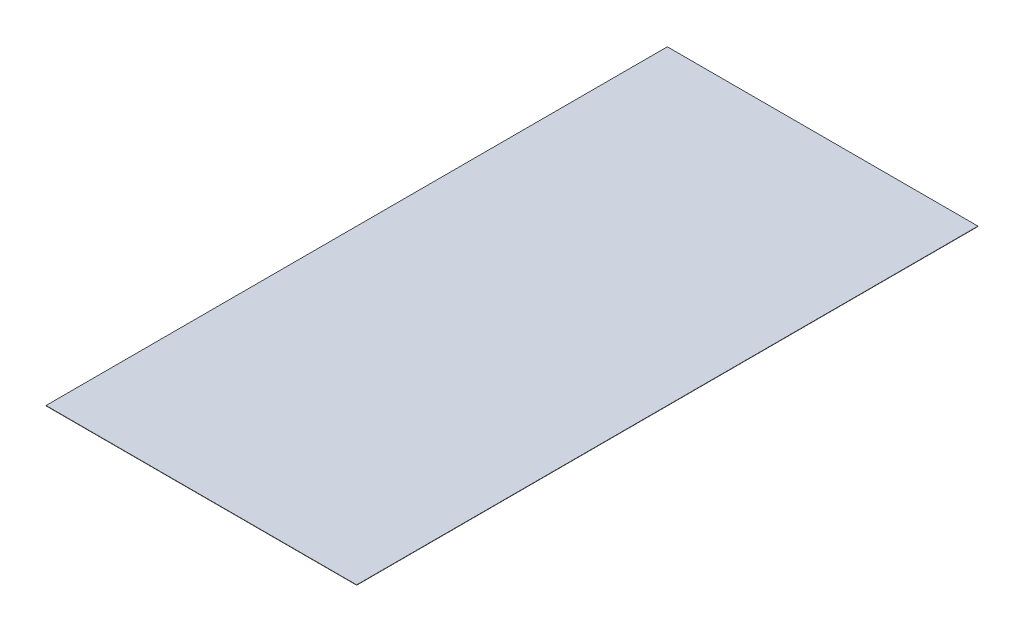
ISO-10303-21;
HEADER;
FILE_DESCRIPTION(('STEP AP214'),'2;1');
FILE_NAME('part.step','',(''),(''),'','','');
FILE_SCHEMA(('AUTOMOTIVE_DESIGN { 1 0 10303 214 1 1 1 1 }'));
ENDSEC;
DATA;
#1=APPLICATION_CONTEXT('core data for automotive mechanical design processes');
#2=APPLICATION_PROTOCOL_DEFINITION('international standard','automotive_design',2000,#1);
#3=PRODUCT_CONTEXT('',#1,'mechanical');
#4=PRODUCT('Part','Part','',(#3));
#5=PRODUCT_RELATED_PRODUCT_CATEGORY('part','',(#4));
#6=PRODUCT_DEFINITION_FORMATION('','',#4);
#7=PRODUCT_DEFINITION_CONTEXT('part definition',#1,'design');
#8=PRODUCT_DEFINITION('design','',#6,#7);
#9=PRODUCT_DEFINITION_SHAPE('','',#8);
#10=(LENGTH_UNIT() NAMED_UNIT(*) SI_UNIT(.MILLI.,.METRE.));
#11=(NAMED_UNIT(*) PLANE_ANGLE_UNIT() SI_UNIT($,.RADIAN.));
#12=(NAMED_UNIT(*) SI_UNIT($,.STERADIAN.) SOLID_ANGLE_UNIT());
#13=UNCERTAINTY_MEASURE_WITH_UNIT(LENGTH_MEASURE(1.E-05),#10,'distance_accuracy_value','');
#14=(GEOMETRIC_REPRESENTATION_CONTEXT(3) GLOBAL_UNCERTAINTY_ASSIGNED_CONTEXT((#13)) GLOBAL_UNIT_ASSIGNED_CONTEXT((#10,
#11,#12)) REPRESENTATION_CONTEXT('',''));
#15=CARTESIAN_POINT('',(0.,0.,0.));
#16=DIRECTION('',(0.,0.,1.));
#17=DIRECTION('',(1.,0.,0.));
#18=AXIS2_PLACEMENT_3D('',#15,#16,#17);
#19=CARTESIAN_POINT('',(609.6,1.24,-1219.2));
#20=DIRECTION('',(-1.,0.,0.));
#21=DIRECTION('',(0.,0.,1.));
#22=AXIS2_PLACEMENT_3D('',#19,#20,#21);
#23=PLANE('',#22);
#24=DIRECTION('',(0.,0.,-1.));
#25=VECTOR('',#24,1.);
#26=CARTESIAN_POINT('',(609.6,0.,-1219.2));
#27=LINE('',#26,#25);
#28=CARTESIAN_POINT('',(609.6,0.,1219.2));
#29=VERTEX_POINT('',#28);
#30=CARTESIAN_POINT('',(609.6,0.,-1219.2));
#31=VERTEX_POINT('',#30);
#32=EDGE_CURVE('E96',#29,#31,#27,.T.);
#33=ORIENTED_EDGE('',*,*,#32,.T.);
#34=DIRECTION('',(0.,-1.,0.));
#35=VECTOR('',#34,1.);
#36=CARTESIAN_POINT('',(609.6,1.24,-1219.2));
#37=LINE('',#36,#35);
#38=CARTESIAN_POINT('',(609.6,1.24,-1219.2));
#39=VERTEX_POINT('',#38);
#40=EDGE_CURVE('E11',#39,#31,#37,.T.);
#41=ORIENTED_EDGE('',*,*,#40,.F.);
#42=DIRECTION('',(0.,0.,-1.));
#43=VECTOR('',#42,1.);
#44=CARTESIAN_POINT('',(609.6,1.24,-1219.2));
#45=LINE('',#44,#43);
#46=CARTESIAN_POINT('',(609.6,1.24,1219.2));
#47=VERTEX_POINT('',#46);
#48=EDGE_CURVE('E84',#47,#39,#45,.T.);
#49=ORIENTED_EDGE('',*,*,#48,.F.);
#50=DIRECTION('',(0.,-1.,0.));
#51=VECTOR('',#50,1.);
#52=CARTESIAN_POINT('',(609.6,1.24,1219.2));
#53=LINE('',#52,#51);
#54=EDGE_CURVE('E92',#47,#29,#53,.T.);
#55=ORIENTED_EDGE('',*,*,#54,.T.);
#56=EDGE_LOOP('',(#33,#41,#49,#55));
#57=FACE_BOUND('',#56,.T.);
#58=ADVANCED_FACE('F33',(#57),#23,.F.);
#59=CARTESIAN_POINT('',(-609.6,1.24,-1219.2));
#60=DIRECTION('',(0.,0.,1.));
#61=DIRECTION('',(1.,0.,0.));
#62=AXIS2_PLACEMENT_3D('',#59,#60,#61);
#63=PLANE('',#62);
#64=DIRECTION('',(-1.,0.,0.));
#65=VECTOR('',#64,1.);
#66=CARTESIAN_POINT('',(-609.6,0.,-1219.2));
#67=LINE('',#66,#65);
#68=CARTESIAN_POINT('',(-609.6,0.,-1219.2));
#69=VERTEX_POINT('',#68);
#70=EDGE_CURVE('E88',#31,#69,#67,.T.);
#71=ORIENTED_EDGE('',*,*,#70,.T.);
#72=DIRECTION('',(0.,-1.,0.));
#73=VECTOR('',#72,1.);
#74=CARTESIAN_POINT('',(-609.6,1.24,-1219.2));
#75=LINE('',#74,#73);
#76=CARTESIAN_POINT('',(-609.6,1.24,-1219.2));
#77=VERTEX_POINT('',#76);
#78=EDGE_CURVE('E41',#77,#69,#75,.T.);
#79=ORIENTED_EDGE('',*,*,#78,.F.);
#80=DIRECTION('',(-1.,0.,0.));
#81=VECTOR('',#80,1.);
#82=CARTESIAN_POINT('',(-609.6,1.24,-1219.2));
#83=LINE('',#82,#81);
#84=EDGE_CURVE('E79',#39,#77,#83,.T.);
#85=ORIENTED_EDGE('',*,*,#84,.F.);
#86=ORIENTED_EDGE('',*,*,#40,.T.);
#87=EDGE_LOOP('',(#71,#79,#85,#86));
#88=FACE_BOUND('',#87,.T.);
#89=ADVANCED_FACE('F87',(#88),#63,.F.);
#90=CARTESIAN_POINT('',(-609.6,1.24,-1219.2));
#91=DIRECTION('',(1.,0.,0.));
#92=DIRECTION('',(0.,0.,-1.));
#93=AXIS2_PLACEMENT_3D('',#90,#91,#92);
#94=PLANE('',#93);
#95=DIRECTION('',(0.,0.,1.));
#96=VECTOR('',#95,1.);
#97=CARTESIAN_POINT('',(-609.6,0.,-1219.2));
#98=LINE('',#97,#96);
#99=CARTESIAN_POINT('',(-609.6,0.,1219.2));
#100=VERTEX_POINT('',#99);
#101=EDGE_CURVE('E66',#69,#100,#98,.T.);
#102=ORIENTED_EDGE('',*,*,#101,.T.);
#103=DIRECTION('',(0.,-1.,0.));
#104=VECTOR('',#103,1.);
#105=CARTESIAN_POINT('',(-609.6,1.24,1219.2));
#106=LINE('',#105,#104);
#107=CARTESIAN_POINT('',(-609.6,1.24,1219.2));
#108=VERTEX_POINT('',#107);
#109=EDGE_CURVE('E89',#108,#100,#106,.T.);
#110=ORIENTED_EDGE('',*,*,#109,.F.);
#111=DIRECTION('',(0.,0.,1.));
#112=VECTOR('',#111,1.);
#113=CARTESIAN_POINT('',(-609.6,1.24,-1219.2));
#114=LINE('',#113,#112);
#115=EDGE_CURVE('E82',#77,#108,#114,.T.);
#116=ORIENTED_EDGE('',*,*,#115,.F.);
#117=ORIENTED_EDGE('',*,*,#78,.T.);
#118=EDGE_LOOP('',(#102,#110,#116,#117));
#119=FACE_BOUND('',#118,.T.);
#120=ADVANCED_FACE('F90',(#119),#94,.F.);
#121=CARTESIAN_POINT('',(-609.6,1.24,1219.2));
#122=DIRECTION('',(0.,0.,-1.));
#123=DIRECTION('',(-1.,0.,0.));
#124=AXIS2_PLACEMENT_3D('',#121,#122,#123);
#125=PLANE('',#124);
#126=DIRECTION('',(1.,0.,0.));
#127=VECTOR('',#126,1.);
#128=CARTESIAN_POINT('',(-609.6,0.,1219.2));
#129=LINE('',#128,#127);
#130=EDGE_CURVE('E72',#100,#29,#129,.T.);
#131=ORIENTED_EDGE('',*,*,#130,.T.);
#132=ORIENTED_EDGE('',*,*,#54,.F.);
#133=DIRECTION('',(1.,0.,0.));
#134=VECTOR('',#133,1.);
#135=CARTESIAN_POINT('',(-609.6,1.24,1219.2));
#136=LINE('',#135,#134);
#137=EDGE_CURVE('E49',#108,#47,#136,.T.);
#138=ORIENTED_EDGE('',*,*,#137,.F.);
#139=ORIENTED_EDGE('',*,*,#109,.T.);
#140=EDGE_LOOP('',(#131,#132,#138,#139));
#141=FACE_BOUND('',#140,.T.);
#142=ADVANCED_FACE('F103',(#141),#125,.F.);
#143=CARTESIAN_POINT('',(0.,1.24,0.));
#144=DIRECTION('',(0.,1.,0.));
#145=DIRECTION('',(0.,0.,1.));
#146=AXIS2_PLACEMENT_3D('',#143,#144,#145);
#147=PLANE('',#146);
#148=ORIENTED_EDGE('',*,*,#48,.T.);
#149=ORIENTED_EDGE('',*,*,#84,.T.);
#150=ORIENTED_EDGE('',*,*,#115,.T.);
#151=ORIENTED_EDGE('',*,*,#137,.T.);
#152=EDGE_LOOP('',(#148,#149,#150,#151));
#153=FACE_BOUND('',#152,.T.);
#154=ADVANCED_FACE('F80',(#153),#147,.T.);
#155=CARTESIAN_POINT('',(0.,0.,0.));
#156=DIRECTION('',(0.,1.,0.));
#157=DIRECTION('',(0.,0.,1.));
#158=AXIS2_PLACEMENT_3D('',#155,#156,#157);
#159=PLANE('',#158);
#160=ORIENTED_EDGE('',*,*,#32,.F.);
#161=ORIENTED_EDGE('',*,*,#130,.F.);
#162=ORIENTED_EDGE('',*,*,#101,.F.);
#163=ORIENTED_EDGE('',*,*,#70,.F.);
#164=EDGE_LOOP('',(#160,#161,#162,#163));
#165=FACE_BOUND('',#164,.T.);
#166=ADVANCED_FACE('F106',(#165),#159,.F.);
#167=CLOSED_SHELL('',(#58,#89,#120,#142,#154,#166));
#168=MANIFOLD_SOLID_BREP('B2',#167);
#169=ADVANCED_BREP_SHAPE_REPRESENTATION('',(#18,#168),#14);
#170=SHAPE_DEFINITION_REPRESENTATION(#9,#169);
ENDSEC;
END-ISO-10303-21;
